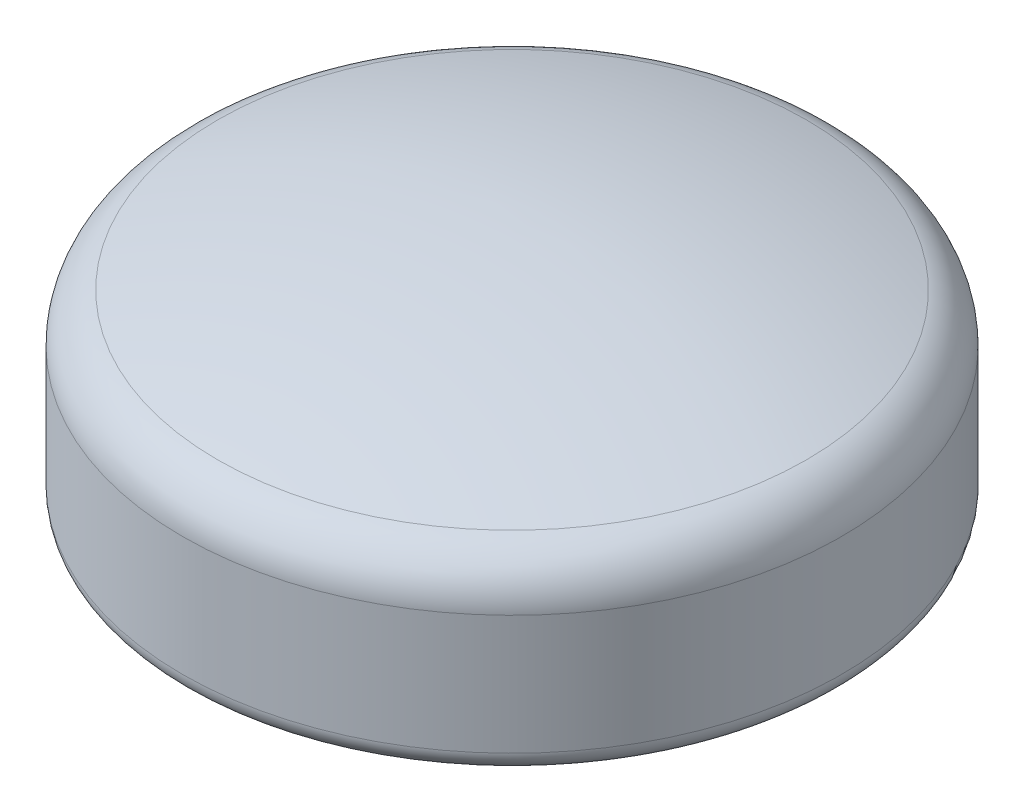
ISO-10303-21;
HEADER;
FILE_DESCRIPTION(('STEP AP214'),'2;1');
FILE_NAME('part.step','',(''),(''),'','','');
FILE_SCHEMA(('AUTOMOTIVE_DESIGN { 1 0 10303 214 1 1 1 1 }'));
ENDSEC;
DATA;
#1=APPLICATION_CONTEXT('core data for automotive mechanical design processes');
#2=APPLICATION_PROTOCOL_DEFINITION('international standard','automotive_design',2000,#1);
#3=PRODUCT_CONTEXT('',#1,'mechanical');
#4=PRODUCT('Part','Part','',(#3));
#5=PRODUCT_RELATED_PRODUCT_CATEGORY('part','',(#4));
#6=PRODUCT_DEFINITION_FORMATION('','',#4);
#7=PRODUCT_DEFINITION_CONTEXT('part definition',#1,'design');
#8=PRODUCT_DEFINITION('design','',#6,#7);
#9=PRODUCT_DEFINITION_SHAPE('','',#8);
#10=(LENGTH_UNIT() NAMED_UNIT(*) SI_UNIT(.MILLI.,.METRE.));
#11=(NAMED_UNIT(*) PLANE_ANGLE_UNIT() SI_UNIT($,.RADIAN.));
#12=(NAMED_UNIT(*) SI_UNIT($,.STERADIAN.) SOLID_ANGLE_UNIT());
#13=UNCERTAINTY_MEASURE_WITH_UNIT(LENGTH_MEASURE(1.E-05),#10,'distance_accuracy_value','');
#14=(GEOMETRIC_REPRESENTATION_CONTEXT(3) GLOBAL_UNCERTAINTY_ASSIGNED_CONTEXT((#13)) GLOBAL_UNIT_ASSIGNED_CONTEXT((#10,
#11,#12)) REPRESENTATION_CONTEXT('',''));
#15=CARTESIAN_POINT('',(0.,0.,0.));
#16=DIRECTION('',(0.,0.,1.));
#17=DIRECTION('',(1.,0.,0.));
#18=AXIS2_PLACEMENT_3D('',#15,#16,#17);
#19=CARTESIAN_POINT('',(0.,-50.1920791322194,0.));
#20=DIRECTION('',(1.,0.,0.));
#21=DIRECTION('',(0.,1.,0.));
#22=AXIS2_PLACEMENT_3D('',#19,#20,#21);
#23=SPHERICAL_SURFACE('',#22,8.49999999999991);
#24=CARTESIAN_POINT('',(0.,-42.1664950413263,0.));
#25=DIRECTION('',(0.,1.,0.));
#26=DIRECTION('',(0.,0.,1.));
#27=AXIS2_PLACEMENT_3D('',#24,#25,#26);
#28=CIRCLE('',#27,2.80000000000004);
#29=CARTESIAN_POINT('',(0.,-42.1664950413263,2.80000000000004));
#30=VERTEX_POINT('',#29);
#31=EDGE_CURVE('E19',#30,#30,#28,.F.);
#32=ORIENTED_EDGE('',*,*,#31,.T.);
#33=EDGE_LOOP('',(#32));
#34=FACE_BOUND('',#33,.T.);
#35=ADVANCED_FACE('F15',(#34),#23,.F.);
#36=CARTESIAN_POINT('',(0.,-42.6792870867729,0.));
#37=DIRECTION('',(0.,1.,0.));
#38=DIRECTION('',(0.,0.,1.));
#39=AXIS2_PLACEMENT_3D('',#36,#37,#38);
#40=CYLINDRICAL_SURFACE('',#39,2.80000000000004);
#41=ORIENTED_EDGE('',*,*,#31,.F.);
#42=EDGE_LOOP('',(#41));
#43=FACE_BOUND('',#42,.T.);
#44=CARTESIAN_POINT('',(0.,-43.1920791322195,0.));
#45=DIRECTION('',(0.,1.,0.));
#46=DIRECTION('',(0.,0.,1.));
#47=AXIS2_PLACEMENT_3D('',#44,#45,#46);
#48=CIRCLE('',#47,2.80000000000004);
#49=CARTESIAN_POINT('',(0.,-43.1920791322195,2.80000000000004));
#50=VERTEX_POINT('',#49);
#51=EDGE_CURVE('E32',#50,#50,#48,.T.);
#52=ORIENTED_EDGE('',*,*,#51,.F.);
#53=EDGE_LOOP('',(#52));
#54=FACE_BOUND('',#53,.T.);
#55=ADVANCED_FACE('F42',(#43,#54),#40,.F.);
#56=CARTESIAN_POINT('',(-3.00000000000003,-43.1920791322195,0.));
#57=DIRECTION('',(0.,-1.,0.));
#58=DIRECTION('',(0.,0.,-1.));
#59=AXIS2_PLACEMENT_3D('',#56,#57,#58);
#60=PLANE('',#59);
#61=ORIENTED_EDGE('',*,*,#51,.T.);
#62=EDGE_LOOP('',(#61));
#63=FACE_BOUND('',#62,.T.);
#64=CARTESIAN_POINT('',(0.,-43.1920791322195,0.));
#65=DIRECTION('',(0.,1.,0.));
#66=DIRECTION('',(-1.,0.,0.));
#67=AXIS2_PLACEMENT_3D('',#64,#65,#66);
#68=CIRCLE('',#67,3.00000000000007);
#69=CARTESIAN_POINT('',(-3.00000000000007,-43.1920791322195,0.));
#70=VERTEX_POINT('',#69);
#71=EDGE_CURVE('E34',#70,#70,#68,.T.);
#72=ORIENTED_EDGE('',*,*,#71,.F.);
#73=EDGE_LOOP('',(#72));
#74=FACE_BOUND('',#73,.T.);
#75=ADVANCED_FACE('F45',(#63,#74),#60,.T.);
#76=CARTESIAN_POINT('',(0.,-42.9920791322195,0.));
#77=DIRECTION('',(0.,1.,0.));
#78=DIRECTION('',(0.,0.,1.));
#79=AXIS2_PLACEMENT_3D('',#76,#77,#78);
#80=TOROIDAL_SURFACE('',#79,3.00000000000007,0.2);
#81=CARTESIAN_POINT('',(0.,-42.9920791322195,0.));
#82=DIRECTION('',(0.,1.,0.));
#83=DIRECTION('',(0.,0.,1.));
#84=AXIS2_PLACEMENT_3D('',#81,#82,#83);
#85=CIRCLE('',#84,3.20000000000007);
#86=CARTESIAN_POINT('',(0.,-42.9920791322195,3.20000000000007));
#87=VERTEX_POINT('',#86);
#88=EDGE_CURVE('E28',#87,#87,#85,.T.);
#89=ORIENTED_EDGE('',*,*,#88,.F.);
#90=EDGE_LOOP('',(#89));
#91=FACE_BOUND('',#90,.T.);
#92=ORIENTED_EDGE('',*,*,#71,.T.);
#93=EDGE_LOOP('',(#92));
#94=FACE_BOUND('',#93,.T.);
#95=ADVANCED_FACE('F51',(#91,#94),#80,.T.);
#96=CARTESIAN_POINT('',(0.,-42.5121907962976,0.));
#97=DIRECTION('',(0.,1.,0.));
#98=DIRECTION('',(0.,0.,1.));
#99=AXIS2_PLACEMENT_3D('',#96,#97,#98);
#100=CYLINDRICAL_SURFACE('',#99,3.20000000000007);
#101=ORIENTED_EDGE('',*,*,#88,.T.);
#102=EDGE_LOOP('',(#101));
#103=FACE_BOUND('',#102,.T.);
#104=CARTESIAN_POINT('',(0.,-41.8323024603756,0.));
#105=DIRECTION('',(0.,1.,0.));
#106=DIRECTION('',(0.,0.,1.));
#107=AXIS2_PLACEMENT_3D('',#104,#105,#106);
#108=CIRCLE('',#107,3.2000000000001);
#109=CARTESIAN_POINT('',(0.,-41.8323024603756,3.2000000000001));
#110=VERTEX_POINT('',#109);
#111=EDGE_CURVE('E23',#110,#110,#108,.T.);
#112=ORIENTED_EDGE('',*,*,#111,.F.);
#113=EDGE_LOOP('',(#112));
#114=FACE_BOUND('',#113,.T.);
#115=ADVANCED_FACE('F60',(#103,#114),#100,.T.);
#116=CARTESIAN_POINT('',(0.,-41.8323024603756,0.));
#117=DIRECTION('',(0.,1.,0.));
#118=DIRECTION('',(0.,0.,1.));
#119=AXIS2_PLACEMENT_3D('',#116,#117,#118);
#120=TOROIDAL_SURFACE('',#119,2.70000000000011,0.499999999999987);
#121=ORIENTED_EDGE('',*,*,#111,.T.);
#122=EDGE_LOOP('',(#121));
#123=FACE_BOUND('',#122,.T.);
#124=CARTESIAN_POINT('',(0.,-41.3581979502671,0.));
#125=DIRECTION('',(0.,1.,0.));
#126=DIRECTION('',(0.,0.,1.));
#127=AXIS2_PLACEMENT_3D('',#124,#125,#126);
#128=CIRCLE('',#127,2.85882352941184);
#129=CARTESIAN_POINT('',(0.,-41.3581979502671,2.85882352941184));
#130=VERTEX_POINT('',#129);
#131=EDGE_CURVE('E10',#130,#130,#128,.T.);
#132=ORIENTED_EDGE('',*,*,#131,.F.);
#133=EDGE_LOOP('',(#132));
#134=FACE_BOUND('',#133,.T.);
#135=ADVANCED_FACE('F55',(#123,#134),#120,.T.);
#136=CARTESIAN_POINT('',(0.,-49.8920791322197,0.));
#137=DIRECTION('',(1.,0.,0.));
#138=DIRECTION('',(0.,1.,0.));
#139=AXIS2_PLACEMENT_3D('',#136,#137,#138);
#140=SPHERICAL_SURFACE('',#139,9.00000000000002);
#141=ORIENTED_EDGE('',*,*,#131,.T.);
#142=EDGE_LOOP('',(#141));
#143=FACE_BOUND('',#142,.T.);
#144=ADVANCED_FACE('F53',(#143),#140,.T.);
#145=CLOSED_SHELL('',(#35,#55,#75,#95,#115,#135,#144));
#146=MANIFOLD_SOLID_BREP('B1',#145);
#147=ADVANCED_BREP_SHAPE_REPRESENTATION('',(#18,#146),#14);
#148=SHAPE_DEFINITION_REPRESENTATION(#9,#147);
ENDSEC;
END-ISO-10303-21;
